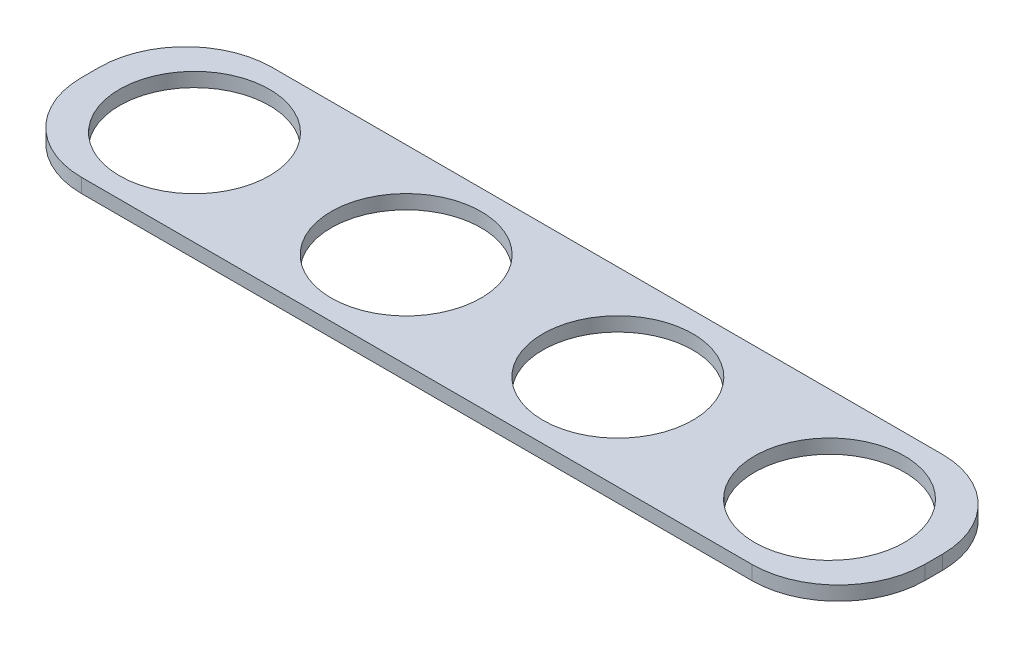
ISO-10303-21;
HEADER;
FILE_DESCRIPTION(('STEP AP214'),'2;1');
FILE_NAME('part.step','',(''),(''),'','','');
FILE_SCHEMA(('AUTOMOTIVE_DESIGN { 1 0 10303 214 1 1 1 1 }'));
ENDSEC;
DATA;
#1=APPLICATION_CONTEXT('core data for automotive mechanical design processes');
#2=APPLICATION_PROTOCOL_DEFINITION('international standard','automotive_design',2000,#1);
#3=PRODUCT_CONTEXT('',#1,'mechanical');
#4=PRODUCT('Part','Part','',(#3));
#5=PRODUCT_RELATED_PRODUCT_CATEGORY('part','',(#4));
#6=PRODUCT_DEFINITION_FORMATION('','',#4);
#7=PRODUCT_DEFINITION_CONTEXT('part definition',#1,'design');
#8=PRODUCT_DEFINITION('design','',#6,#7);
#9=PRODUCT_DEFINITION_SHAPE('','',#8);
#10=(LENGTH_UNIT() NAMED_UNIT(*) SI_UNIT(.MILLI.,.METRE.));
#11=(NAMED_UNIT(*) PLANE_ANGLE_UNIT() SI_UNIT($,.RADIAN.));
#12=(NAMED_UNIT(*) SI_UNIT($,.STERADIAN.) SOLID_ANGLE_UNIT());
#13=UNCERTAINTY_MEASURE_WITH_UNIT(LENGTH_MEASURE(1.E-05),#10,'distance_accuracy_value','');
#14=(GEOMETRIC_REPRESENTATION_CONTEXT(3) GLOBAL_UNCERTAINTY_ASSIGNED_CONTEXT((#13)) GLOBAL_UNIT_ASSIGNED_CONTEXT((#10,
#11,#12)) REPRESENTATION_CONTEXT('',''));
#15=CARTESIAN_POINT('',(0.,0.,0.));
#16=DIRECTION('',(0.,0.,1.));
#17=DIRECTION('',(1.,0.,0.));
#18=AXIS2_PLACEMENT_3D('',#15,#16,#17);
#19=CARTESIAN_POINT('',(-23.9,0.8,5.4));
#20=DIRECTION('',(1.,0.,0.));
#21=DIRECTION('',(0.,0.,-1.));
#22=AXIS2_PLACEMENT_3D('',#19,#20,#21);
#23=PLANE('',#22);
#24=DIRECTION('',(0.,0.,1.));
#25=VECTOR('',#24,1.);
#26=CARTESIAN_POINT('',(-23.9,0.8,5.4));
#27=LINE('',#26,#25);
#28=CARTESIAN_POINT('',(-23.9,0.8,-0.500000000000005));
#29=VERTEX_POINT('',#28);
#30=CARTESIAN_POINT('',(-23.9,0.8,0.5));
#31=VERTEX_POINT('',#30);
#32=EDGE_CURVE('E118',#29,#31,#27,.T.);
#33=ORIENTED_EDGE('',*,*,#32,.F.);
#34=DIRECTION('',(0.,-1.,0.));
#35=VECTOR('',#34,1.);
#36=CARTESIAN_POINT('',(-23.9,0.8,-0.500000000000007));
#37=LINE('',#36,#35);
#38=CARTESIAN_POINT('',(-23.9,0.,-0.500000000000005));
#39=VERTEX_POINT('',#38);
#40=EDGE_CURVE('E103',#29,#39,#37,.T.);
#41=ORIENTED_EDGE('',*,*,#40,.T.);
#42=DIRECTION('',(0.,0.,1.));
#43=VECTOR('',#42,1.);
#44=CARTESIAN_POINT('',(-23.9,0.,5.4));
#45=LINE('',#44,#43);
#46=CARTESIAN_POINT('',(-23.9,0.,0.5));
#47=VERTEX_POINT('',#46);
#48=EDGE_CURVE('E115',#39,#47,#45,.T.);
#49=ORIENTED_EDGE('',*,*,#48,.T.);
#50=DIRECTION('',(0.,-1.,0.));
#51=VECTOR('',#50,1.);
#52=CARTESIAN_POINT('',(-23.9,0.8,0.499999999999998));
#53=LINE('',#52,#51);
#54=EDGE_CURVE('E120',#47,#31,#53,.F.);
#55=ORIENTED_EDGE('',*,*,#54,.T.);
#56=EDGE_LOOP('',(#33,#41,#49,#55));
#57=FACE_BOUND('',#56,.T.);
#58=ADVANCED_FACE('F33',(#57),#23,.F.);
#59=CARTESIAN_POINT('',(23.9,0.8,5.39999999999999));
#60=DIRECTION('',(0.,0.,-1.));
#61=DIRECTION('',(-1.,0.,0.));
#62=AXIS2_PLACEMENT_3D('',#59,#60,#61);
#63=PLANE('',#62);
#64=DIRECTION('',(1.,0.,0.));
#65=VECTOR('',#64,1.);
#66=CARTESIAN_POINT('',(23.9,0.,5.39999999999999));
#67=LINE('',#66,#65);
#68=CARTESIAN_POINT('',(-19.,0.,5.4));
#69=VERTEX_POINT('',#68);
#70=CARTESIAN_POINT('',(19.,0.,5.39999999999999));
#71=VERTEX_POINT('',#70);
#72=EDGE_CURVE('E124',#69,#71,#67,.T.);
#73=ORIENTED_EDGE('',*,*,#72,.T.);
#74=DIRECTION('',(0.,-1.,0.));
#75=VECTOR('',#74,1.);
#76=CARTESIAN_POINT('',(19.,0.8,5.39999999999999));
#77=LINE('',#76,#75);
#78=CARTESIAN_POINT('',(19.,0.8,5.39999999999999));
#79=VERTEX_POINT('',#78);
#80=EDGE_CURVE('E11',#71,#79,#77,.F.);
#81=ORIENTED_EDGE('',*,*,#80,.T.);
#82=DIRECTION('',(1.,0.,0.));
#83=VECTOR('',#82,1.);
#84=CARTESIAN_POINT('',(23.9,0.8,5.39999999999999));
#85=LINE('',#84,#83);
#86=CARTESIAN_POINT('',(-19.,0.8,5.4));
#87=VERTEX_POINT('',#86);
#88=EDGE_CURVE('E164',#87,#79,#85,.T.);
#89=ORIENTED_EDGE('',*,*,#88,.F.);
#90=DIRECTION('',(0.,-1.,0.));
#91=VECTOR('',#90,1.);
#92=CARTESIAN_POINT('',(-19.,0.8,5.4));
#93=LINE('',#92,#91);
#94=EDGE_CURVE('E41',#87,#69,#93,.T.);
#95=ORIENTED_EDGE('',*,*,#94,.T.);
#96=EDGE_LOOP('',(#73,#81,#89,#95));
#97=FACE_BOUND('',#96,.T.);
#98=ADVANCED_FACE('F162',(#97),#63,.F.);
#99=CARTESIAN_POINT('',(23.9,0.8,5.39999999999999));
#100=DIRECTION('',(-1.,0.,0.));
#101=DIRECTION('',(0.,0.,1.));
#102=AXIS2_PLACEMENT_3D('',#99,#100,#101);
#103=PLANE('',#102);
#104=DIRECTION('',(0.,0.,-1.));
#105=VECTOR('',#104,1.);
#106=CARTESIAN_POINT('',(23.9,0.,5.39999999999999));
#107=LINE('',#106,#105);
#108=CARTESIAN_POINT('',(23.9,0.,0.499999999999995));
#109=VERTEX_POINT('',#108);
#110=CARTESIAN_POINT('',(23.9,0.,-0.50000000000001));
#111=VERTEX_POINT('',#110);
#112=EDGE_CURVE('E128',#109,#111,#107,.T.);
#113=ORIENTED_EDGE('',*,*,#112,.T.);
#114=DIRECTION('',(0.,-1.,0.));
#115=VECTOR('',#114,1.);
#116=CARTESIAN_POINT('',(23.9,0.8,-0.500000000000012));
#117=LINE('',#116,#115);
#118=CARTESIAN_POINT('',(23.9,0.8,-0.50000000000001));
#119=VERTEX_POINT('',#118);
#120=EDGE_CURVE('E48',#111,#119,#117,.F.);
#121=ORIENTED_EDGE('',*,*,#120,.T.);
#122=DIRECTION('',(0.,0.,-1.));
#123=VECTOR('',#122,1.);
#124=CARTESIAN_POINT('',(23.9,0.8,5.39999999999999));
#125=LINE('',#124,#123);
#126=CARTESIAN_POINT('',(23.9,0.8,0.499999999999995));
#127=VERTEX_POINT('',#126);
#128=EDGE_CURVE('E172',#127,#119,#125,.T.);
#129=ORIENTED_EDGE('',*,*,#128,.F.);
#130=DIRECTION('',(0.,-1.,0.));
#131=VECTOR('',#130,1.);
#132=CARTESIAN_POINT('',(23.9,0.8,0.499999999999994));
#133=LINE('',#132,#131);
#134=EDGE_CURVE('E155',#127,#109,#133,.T.);
#135=ORIENTED_EDGE('',*,*,#134,.T.);
#136=EDGE_LOOP('',(#113,#121,#129,#135));
#137=FACE_BOUND('',#136,.T.);
#138=ADVANCED_FACE('F171',(#137),#103,.F.);
#139=CARTESIAN_POINT('',(23.9,0.8,-5.40000000000001));
#140=DIRECTION('',(0.,0.,1.));
#141=DIRECTION('',(1.,0.,0.));
#142=AXIS2_PLACEMENT_3D('',#139,#140,#141);
#143=PLANE('',#142);
#144=DIRECTION('',(-1.,0.,0.));
#145=VECTOR('',#144,1.);
#146=CARTESIAN_POINT('',(23.9,0.,-5.40000000000001));
#147=LINE('',#146,#145);
#148=CARTESIAN_POINT('',(19.,0.,-5.40000000000001));
#149=VERTEX_POINT('',#148);
#150=CARTESIAN_POINT('',(-19.,0.,-5.40000000000001));
#151=VERTEX_POINT('',#150);
#152=EDGE_CURVE('E138',#149,#151,#147,.T.);
#153=ORIENTED_EDGE('',*,*,#152,.T.);
#154=DIRECTION('',(0.,-1.,0.));
#155=VECTOR('',#154,1.);
#156=CARTESIAN_POINT('',(-19.,0.8,-5.40000000000001));
#157=LINE('',#156,#155);
#158=CARTESIAN_POINT('',(-19.,0.8,-5.40000000000001));
#159=VERTEX_POINT('',#158);
#160=EDGE_CURVE('E104',#151,#159,#157,.F.);
#161=ORIENTED_EDGE('',*,*,#160,.T.);
#162=DIRECTION('',(-1.,0.,0.));
#163=VECTOR('',#162,1.);
#164=CARTESIAN_POINT('',(23.9,0.8,-5.40000000000001));
#165=LINE('',#164,#163);
#166=CARTESIAN_POINT('',(19.,0.8,-5.40000000000001));
#167=VERTEX_POINT('',#166);
#168=EDGE_CURVE('E134',#167,#159,#165,.T.);
#169=ORIENTED_EDGE('',*,*,#168,.F.);
#170=DIRECTION('',(0.,-1.,0.));
#171=VECTOR('',#170,1.);
#172=CARTESIAN_POINT('',(19.,0.8,-5.40000000000001));
#173=LINE('',#172,#171);
#174=EDGE_CURVE('E109',#167,#149,#173,.T.);
#175=ORIENTED_EDGE('',*,*,#174,.T.);
#176=EDGE_LOOP('',(#153,#161,#169,#175));
#177=FACE_BOUND('',#176,.T.);
#178=ADVANCED_FACE('F205',(#177),#143,.F.);
#179=CARTESIAN_POINT('',(0.,0.8,0.));
#180=DIRECTION('',(0.,1.,0.));
#181=DIRECTION('',(0.,0.,1.));
#182=AXIS2_PLACEMENT_3D('',#179,#180,#181);
#183=PLANE('',#182);
#184=CARTESIAN_POINT('',(-18.,0.8,0.));
#185=DIRECTION('',(0.,1.,0.));
#186=DIRECTION('',(0.,0.,1.));
#187=AXIS2_PLACEMENT_3D('',#184,#185,#186);
#188=CIRCLE('',#187,4.25);
#189=CARTESIAN_POINT('',(-18.,0.8,4.25));
#190=VERTEX_POINT('',#189);
#191=EDGE_CURVE('E184',#190,#190,#188,.T.);
#192=ORIENTED_EDGE('',*,*,#191,.F.);
#193=EDGE_LOOP('',(#192));
#194=FACE_BOUND('',#193,.T.);
#195=CARTESIAN_POINT('',(18.,0.8,0.));
#196=DIRECTION('',(0.,1.,0.));
#197=DIRECTION('',(0.,0.,-1.));
#198=AXIS2_PLACEMENT_3D('',#195,#196,#197);
#199=CIRCLE('',#198,4.25);
#200=CARTESIAN_POINT('',(18.,0.8,4.24999999999999));
#201=VERTEX_POINT('',#200);
#202=EDGE_CURVE('E185',#201,#201,#199,.T.);
#203=ORIENTED_EDGE('',*,*,#202,.F.);
#204=EDGE_LOOP('',(#203));
#205=FACE_BOUND('',#204,.T.);
#206=CARTESIAN_POINT('',(5.99999999999998,0.8,0.));
#207=DIRECTION('',(0.,1.,0.));
#208=DIRECTION('',(0.,0.,-1.));
#209=AXIS2_PLACEMENT_3D('',#206,#207,#208);
#210=CIRCLE('',#209,4.25);
#211=CARTESIAN_POINT('',(5.99999999999998,0.8,4.25));
#212=VERTEX_POINT('',#211);
#213=EDGE_CURVE('E195',#212,#212,#210,.T.);
#214=ORIENTED_EDGE('',*,*,#213,.F.);
#215=EDGE_LOOP('',(#214));
#216=FACE_BOUND('',#215,.T.);
#217=CARTESIAN_POINT('',(-6.00000000000002,0.8,0.));
#218=DIRECTION('',(0.,1.,0.));
#219=DIRECTION('',(0.,0.,1.));
#220=AXIS2_PLACEMENT_3D('',#217,#218,#219);
#221=CIRCLE('',#220,4.25);
#222=CARTESIAN_POINT('',(-6.00000000000002,0.8,4.25));
#223=VERTEX_POINT('',#222);
#224=EDGE_CURVE('E131',#223,#223,#221,.T.);
#225=ORIENTED_EDGE('',*,*,#224,.F.);
#226=EDGE_LOOP('',(#225));
#227=FACE_BOUND('',#226,.T.);
#228=ORIENTED_EDGE('',*,*,#168,.T.);
#229=CARTESIAN_POINT('',(-19.,0.8,-0.500000000000007));
#230=DIRECTION('',(0.,1.,0.));
#231=DIRECTION('',(0.,0.,1.));
#232=AXIS2_PLACEMENT_3D('',#229,#230,#231);
#233=CIRCLE('',#232,4.9);
#234=EDGE_CURVE('E153',#159,#29,#233,.T.);
#235=ORIENTED_EDGE('',*,*,#234,.T.);
#236=ORIENTED_EDGE('',*,*,#32,.T.);
#237=CARTESIAN_POINT('',(-19.,0.8,0.499999999999998));
#238=DIRECTION('',(0.,1.,0.));
#239=DIRECTION('',(0.,0.,1.));
#240=AXIS2_PLACEMENT_3D('',#237,#238,#239);
#241=CIRCLE('',#240,4.9);
#242=EDGE_CURVE('E148',#31,#87,#241,.T.);
#243=ORIENTED_EDGE('',*,*,#242,.T.);
#244=ORIENTED_EDGE('',*,*,#88,.T.);
#245=CARTESIAN_POINT('',(19.,0.8,0.499999999999994));
#246=DIRECTION('',(0.,1.,0.));
#247=DIRECTION('',(0.,0.,1.));
#248=AXIS2_PLACEMENT_3D('',#245,#246,#247);
#249=CIRCLE('',#248,4.9);
#250=EDGE_CURVE('E55',#79,#127,#249,.T.);
#251=ORIENTED_EDGE('',*,*,#250,.T.);
#252=ORIENTED_EDGE('',*,*,#128,.T.);
#253=CARTESIAN_POINT('',(19.,0.8,-0.500000000000012));
#254=DIRECTION('',(0.,1.,0.));
#255=DIRECTION('',(0.,0.,1.));
#256=AXIS2_PLACEMENT_3D('',#253,#254,#255);
#257=CIRCLE('',#256,4.9);
#258=EDGE_CURVE('E151',#119,#167,#257,.T.);
#259=ORIENTED_EDGE('',*,*,#258,.T.);
#260=EDGE_LOOP('',(#228,#235,#236,#243,#244,#251,#252,#259));
#261=FACE_BOUND('',#260,.T.);
#262=ADVANCED_FACE('F202',(#194,#205,#216,#227,#261),#183,.T.);
#263=CARTESIAN_POINT('',(0.,0.,0.));
#264=DIRECTION('',(0.,1.,0.));
#265=DIRECTION('',(0.,0.,1.));
#266=AXIS2_PLACEMENT_3D('',#263,#264,#265);
#267=PLANE('',#266);
#268=CARTESIAN_POINT('',(-18.,0.,0.));
#269=DIRECTION('',(0.,1.,0.));
#270=DIRECTION('',(0.,0.,1.));
#271=AXIS2_PLACEMENT_3D('',#268,#269,#270);
#272=CIRCLE('',#271,4.25);
#273=CARTESIAN_POINT('',(-18.,0.,4.25));
#274=VERTEX_POINT('',#273);
#275=EDGE_CURVE('E180',#274,#274,#272,.F.);
#276=ORIENTED_EDGE('',*,*,#275,.F.);
#277=EDGE_LOOP('',(#276));
#278=FACE_BOUND('',#277,.T.);
#279=CARTESIAN_POINT('',(18.,0.,0.));
#280=DIRECTION('',(0.,1.,0.));
#281=DIRECTION('',(0.,0.,1.));
#282=AXIS2_PLACEMENT_3D('',#279,#280,#281);
#283=CIRCLE('',#282,4.25);
#284=CARTESIAN_POINT('',(18.,0.,4.24999999999999));
#285=VERTEX_POINT('',#284);
#286=EDGE_CURVE('E181',#285,#285,#283,.F.);
#287=ORIENTED_EDGE('',*,*,#286,.F.);
#288=EDGE_LOOP('',(#287));
#289=FACE_BOUND('',#288,.T.);
#290=CARTESIAN_POINT('',(5.99999999999998,0.,0.));
#291=DIRECTION('',(0.,1.,0.));
#292=DIRECTION('',(0.,0.,1.));
#293=AXIS2_PLACEMENT_3D('',#290,#291,#292);
#294=CIRCLE('',#293,4.25);
#295=CARTESIAN_POINT('',(5.99999999999998,0.,4.25));
#296=VERTEX_POINT('',#295);
#297=EDGE_CURVE('E188',#296,#296,#294,.F.);
#298=ORIENTED_EDGE('',*,*,#297,.F.);
#299=EDGE_LOOP('',(#298));
#300=FACE_BOUND('',#299,.T.);
#301=CARTESIAN_POINT('',(-6.00000000000002,0.,0.));
#302=DIRECTION('',(0.,1.,0.));
#303=DIRECTION('',(0.,0.,1.));
#304=AXIS2_PLACEMENT_3D('',#301,#302,#303);
#305=CIRCLE('',#304,4.25);
#306=CARTESIAN_POINT('',(-6.00000000000002,0.,4.25));
#307=VERTEX_POINT('',#306);
#308=EDGE_CURVE('E125',#307,#307,#305,.F.);
#309=ORIENTED_EDGE('',*,*,#308,.F.);
#310=EDGE_LOOP('',(#309));
#311=FACE_BOUND('',#310,.T.);
#312=ORIENTED_EDGE('',*,*,#48,.F.);
#313=CARTESIAN_POINT('',(-19.,0.,-0.500000000000007));
#314=DIRECTION('',(0.,1.,0.));
#315=DIRECTION('',(0.,0.,1.));
#316=AXIS2_PLACEMENT_3D('',#313,#314,#315);
#317=CIRCLE('',#316,4.9);
#318=EDGE_CURVE('E99',#39,#151,#317,.F.);
#319=ORIENTED_EDGE('',*,*,#318,.T.);
#320=ORIENTED_EDGE('',*,*,#152,.F.);
#321=CARTESIAN_POINT('',(19.,0.,-0.500000000000012));
#322=DIRECTION('',(0.,1.,0.));
#323=DIRECTION('',(0.,0.,1.));
#324=AXIS2_PLACEMENT_3D('',#321,#322,#323);
#325=CIRCLE('',#324,4.9);
#326=EDGE_CURVE('E110',#149,#111,#325,.F.);
#327=ORIENTED_EDGE('',*,*,#326,.T.);
#328=ORIENTED_EDGE('',*,*,#112,.F.);
#329=CARTESIAN_POINT('',(19.,0.,0.499999999999994));
#330=DIRECTION('',(0.,1.,0.));
#331=DIRECTION('',(0.,0.,1.));
#332=AXIS2_PLACEMENT_3D('',#329,#330,#331);
#333=CIRCLE('',#332,4.9);
#334=EDGE_CURVE('E142',#109,#71,#333,.F.);
#335=ORIENTED_EDGE('',*,*,#334,.T.);
#336=ORIENTED_EDGE('',*,*,#72,.F.);
#337=CARTESIAN_POINT('',(-19.,0.,0.499999999999998));
#338=DIRECTION('',(0.,1.,0.));
#339=DIRECTION('',(0.,0.,1.));
#340=AXIS2_PLACEMENT_3D('',#337,#338,#339);
#341=CIRCLE('',#340,4.9);
#342=EDGE_CURVE('E119',#69,#47,#341,.F.);
#343=ORIENTED_EDGE('',*,*,#342,.T.);
#344=EDGE_LOOP('',(#312,#319,#320,#327,#328,#335,#336,#343));
#345=FACE_BOUND('',#344,.T.);
#346=ADVANCED_FACE('F122',(#278,#289,#300,#311,#345),#267,.F.);
#347=CARTESIAN_POINT('',(-6.00000000000002,-0.00100000000000002,0.));
#348=DIRECTION('',(0.,1.,0.));
#349=DIRECTION('',(0.,0.,1.));
#350=AXIS2_PLACEMENT_3D('',#347,#348,#349);
#351=CYLINDRICAL_SURFACE('',#350,4.25);
#352=CARTESIAN_POINT('',(-6.00000000000002,0.8,4.25));
#353=CARTESIAN_POINT('',(-6.00000000000002,0.791666666666667,4.25));
#354=CARTESIAN_POINT('',(-6.00000000000002,0.783333333333333,4.25));
#355=CARTESIAN_POINT('',(-6.00000000000002,0.766666666666667,4.25));
#356=CARTESIAN_POINT('',(-6.00000000000002,0.758333333333333,4.25));
#357=CARTESIAN_POINT('',(-6.00000000000002,0.741666666666667,4.25));
#358=CARTESIAN_POINT('',(-6.00000000000002,0.733333333333333,4.25));
#359=CARTESIAN_POINT('',(-6.00000000000002,0.716666666666667,4.25));
#360=CARTESIAN_POINT('',(-6.00000000000002,0.708333333333333,4.25));
#361=CARTESIAN_POINT('',(-6.00000000000002,0.691666666666667,4.25));
#362=CARTESIAN_POINT('',(-6.00000000000002,0.683333333333333,4.25));
#363=CARTESIAN_POINT('',(-6.00000000000002,0.666666666666667,4.25));
#364=CARTESIAN_POINT('',(-6.00000000000002,0.658333333333333,4.25));
#365=CARTESIAN_POINT('',(-6.00000000000002,0.641666666666667,4.25));
#366=CARTESIAN_POINT('',(-6.00000000000002,0.633333333333333,4.25));
#367=CARTESIAN_POINT('',(-6.00000000000002,0.616666666666667,4.25));
#368=CARTESIAN_POINT('',(-6.00000000000002,0.608333333333333,4.25));
#369=CARTESIAN_POINT('',(-6.00000000000002,0.591666666666667,4.25));
#370=CARTESIAN_POINT('',(-6.00000000000002,0.583333333333333,4.25));
#371=CARTESIAN_POINT('',(-6.00000000000002,0.566666666666667,4.25));
#372=CARTESIAN_POINT('',(-6.00000000000002,0.558333333333333,4.25));
#373=CARTESIAN_POINT('',(-6.00000000000002,0.541666666666667,4.25));
#374=CARTESIAN_POINT('',(-6.00000000000002,0.533333333333333,4.25));
#375=CARTESIAN_POINT('',(-6.00000000000002,0.516666666666667,4.25));
#376=CARTESIAN_POINT('',(-6.00000000000002,0.508333333333333,4.25));
#377=CARTESIAN_POINT('',(-6.00000000000002,0.491666666666667,4.25));
#378=CARTESIAN_POINT('',(-6.00000000000002,0.483333333333333,4.25));
#379=CARTESIAN_POINT('',(-6.00000000000002,0.466666666666667,4.25));
#380=CARTESIAN_POINT('',(-6.00000000000002,0.458333333333333,4.25));
#381=CARTESIAN_POINT('',(-6.00000000000002,0.441666666666667,4.25));
#382=CARTESIAN_POINT('',(-6.00000000000002,0.433333333333333,4.25));
#383=CARTESIAN_POINT('',(-6.00000000000002,0.416666666666667,4.25));
#384=CARTESIAN_POINT('',(-6.00000000000002,0.408333333333333,4.25));
#385=CARTESIAN_POINT('',(-6.00000000000002,0.391666666666667,4.25));
#386=CARTESIAN_POINT('',(-6.00000000000002,0.383333333333333,4.25));
#387=CARTESIAN_POINT('',(-6.00000000000002,0.366666666666667,4.25));
#388=CARTESIAN_POINT('',(-6.00000000000002,0.358333333333333,4.25));
#389=CARTESIAN_POINT('',(-6.00000000000002,0.341666666666667,4.25));
#390=CARTESIAN_POINT('',(-6.00000000000002,0.333333333333333,4.25));
#391=CARTESIAN_POINT('',(-6.00000000000002,0.316666666666667,4.25));
#392=CARTESIAN_POINT('',(-6.00000000000002,0.308333333333333,4.25));
#393=CARTESIAN_POINT('',(-6.00000000000002,0.291666666666667,4.25));
#394=CARTESIAN_POINT('',(-6.00000000000002,0.283333333333333,4.25));
#395=CARTESIAN_POINT('',(-6.00000000000002,0.266666666666667,4.25));
#396=CARTESIAN_POINT('',(-6.00000000000002,0.258333333333333,4.25));
#397=CARTESIAN_POINT('',(-6.00000000000002,0.241666666666667,4.25));
#398=CARTESIAN_POINT('',(-6.00000000000002,0.233333333333333,4.25));
#399=CARTESIAN_POINT('',(-6.00000000000002,0.216666666666667,4.25));
#400=CARTESIAN_POINT('',(-6.00000000000002,0.208333333333333,4.25));
#401=CARTESIAN_POINT('',(-6.00000000000002,0.191666666666667,4.25));
#402=CARTESIAN_POINT('',(-6.00000000000002,0.183333333333333,4.25));
#403=CARTESIAN_POINT('',(-6.00000000000002,0.166666666666667,4.25));
#404=CARTESIAN_POINT('',(-6.00000000000002,0.158333333333333,4.25));
#405=CARTESIAN_POINT('',(-6.00000000000002,0.141666666666667,4.25));
#406=CARTESIAN_POINT('',(-6.00000000000002,0.133333333333333,4.25));
#407=CARTESIAN_POINT('',(-6.00000000000002,0.116666666666667,4.25));
#408=CARTESIAN_POINT('',(-6.00000000000002,0.108333333333333,4.25));
#409=CARTESIAN_POINT('',(-6.00000000000002,0.0916666666666667,4.25));
#410=CARTESIAN_POINT('',(-6.00000000000002,0.0833333333333333,4.25));
#411=CARTESIAN_POINT('',(-6.00000000000002,0.0666666666666666,4.25));
#412=CARTESIAN_POINT('',(-6.00000000000002,0.0583333333333333,4.25));
#413=CARTESIAN_POINT('',(-6.00000000000002,0.0416666666666667,4.25));
#414=CARTESIAN_POINT('',(-6.00000000000002,0.0333333333333333,4.25));
#415=CARTESIAN_POINT('',(-6.00000000000002,0.0166666666666666,4.25));
#416=CARTESIAN_POINT('',(-6.00000000000002,0.00833333333333331,4.25));
#417=CARTESIAN_POINT('',(-6.00000000000002,0.,4.25));
#418=B_SPLINE_CURVE_WITH_KNOTS('',3,(#352,#353,#354,#355,#356,#357,#358,#359,#360,#361,#362,
#363,#364,#365,#366,#367,#368,#369,#370,#371,#372,#373,#374,#375,#376,#377,#378,#379,#380,#381,
#382,#383,#384,#385,#386,#387,#388,#389,#390,#391,#392,#393,#394,#395,#396,#397,#398,#399,#400,
#401,#402,#403,#404,#405,#406,#407,#408,#409,#410,#411,#412,#413,#414,#415,#416,#417),
.UNSPECIFIED.,.F.,.F.,(4,2,2,2,2,2,2,2,2,2,2,2,2,2,2,2,2,2,2,2,2,2,2,2,2,2,2,2,2,2,2,2,4),(0.,
0.025,0.05,0.075,0.1,0.125,0.15,0.175,0.2,0.225,0.25,0.275,0.3,0.325,0.35,0.375,0.4,0.425,0.45,
0.475,0.5,0.525,0.55,0.575,0.6,0.625,0.65,0.675,0.7,0.725,0.75,0.775,0.8),.UNSPECIFIED.);
#419=EDGE_CURVE('BSEAM234',#223,#307,#418,.T.);
#420=ORIENTED_EDGE('',*,*,#224,.T.);
#421=ORIENTED_EDGE('',*,*,#308,.T.);
#422=ORIENTED_EDGE('',*,*,#419,.T.);
#423=ORIENTED_EDGE('',*,*,#419,.F.);
#424=EDGE_LOOP('',(#420,#422,#421,#423));
#425=FACE_BOUND('',#424,.T.);
#426=ADVANCED_FACE('F234',(#425),#351,.F.);
#427=CARTESIAN_POINT('',(5.99999999999998,-0.00100000000000002,0.));
#428=DIRECTION('',(0.,1.,0.));
#429=DIRECTION('',(0.,0.,1.));
#430=AXIS2_PLACEMENT_3D('',#427,#428,#429);
#431=CYLINDRICAL_SURFACE('',#430,4.25);
#432=CARTESIAN_POINT('',(5.99999999999998,0.8,4.25));
#433=CARTESIAN_POINT('',(5.99999999999998,0.791666666666667,4.25));
#434=CARTESIAN_POINT('',(5.99999999999998,0.783333333333333,4.25));
#435=CARTESIAN_POINT('',(5.99999999999998,0.766666666666667,4.25));
#436=CARTESIAN_POINT('',(5.99999999999998,0.758333333333333,4.25));
#437=CARTESIAN_POINT('',(5.99999999999998,0.741666666666667,4.25));
#438=CARTESIAN_POINT('',(5.99999999999998,0.733333333333333,4.25));
#439=CARTESIAN_POINT('',(5.99999999999998,0.716666666666667,4.25));
#440=CARTESIAN_POINT('',(5.99999999999998,0.708333333333333,4.25));
#441=CARTESIAN_POINT('',(5.99999999999998,0.691666666666667,4.25));
#442=CARTESIAN_POINT('',(5.99999999999998,0.683333333333333,4.25));
#443=CARTESIAN_POINT('',(5.99999999999998,0.666666666666667,4.25));
#444=CARTESIAN_POINT('',(5.99999999999998,0.658333333333333,4.25));
#445=CARTESIAN_POINT('',(5.99999999999998,0.641666666666667,4.25));
#446=CARTESIAN_POINT('',(5.99999999999998,0.633333333333333,4.25));
#447=CARTESIAN_POINT('',(5.99999999999998,0.616666666666667,4.25));
#448=CARTESIAN_POINT('',(5.99999999999998,0.608333333333333,4.25));
#449=CARTESIAN_POINT('',(5.99999999999998,0.591666666666667,4.25));
#450=CARTESIAN_POINT('',(5.99999999999998,0.583333333333333,4.25));
#451=CARTESIAN_POINT('',(5.99999999999998,0.566666666666667,4.25));
#452=CARTESIAN_POINT('',(5.99999999999998,0.558333333333333,4.25));
#453=CARTESIAN_POINT('',(5.99999999999998,0.541666666666667,4.25));
#454=CARTESIAN_POINT('',(5.99999999999998,0.533333333333333,4.25));
#455=CARTESIAN_POINT('',(5.99999999999998,0.516666666666667,4.25));
#456=CARTESIAN_POINT('',(5.99999999999998,0.508333333333333,4.25));
#457=CARTESIAN_POINT('',(5.99999999999998,0.491666666666667,4.25));
#458=CARTESIAN_POINT('',(5.99999999999998,0.483333333333333,4.25));
#459=CARTESIAN_POINT('',(5.99999999999998,0.466666666666667,4.25));
#460=CARTESIAN_POINT('',(5.99999999999998,0.458333333333333,4.25));
#461=CARTESIAN_POINT('',(5.99999999999998,0.441666666666667,4.25));
#462=CARTESIAN_POINT('',(5.99999999999998,0.433333333333333,4.25));
#463=CARTESIAN_POINT('',(5.99999999999998,0.416666666666667,4.25));
#464=CARTESIAN_POINT('',(5.99999999999998,0.408333333333333,4.25));
#465=CARTESIAN_POINT('',(5.99999999999998,0.391666666666667,4.25));
#466=CARTESIAN_POINT('',(5.99999999999998,0.383333333333333,4.25));
#467=CARTESIAN_POINT('',(5.99999999999998,0.366666666666667,4.25));
#468=CARTESIAN_POINT('',(5.99999999999998,0.358333333333333,4.25));
#469=CARTESIAN_POINT('',(5.99999999999998,0.341666666666667,4.25));
#470=CARTESIAN_POINT('',(5.99999999999998,0.333333333333333,4.25));
#471=CARTESIAN_POINT('',(5.99999999999998,0.316666666666667,4.25));
#472=CARTESIAN_POINT('',(5.99999999999998,0.308333333333333,4.25));
#473=CARTESIAN_POINT('',(5.99999999999998,0.291666666666667,4.25));
#474=CARTESIAN_POINT('',(5.99999999999998,0.283333333333333,4.25));
#475=CARTESIAN_POINT('',(5.99999999999998,0.266666666666667,4.25));
#476=CARTESIAN_POINT('',(5.99999999999998,0.258333333333333,4.25));
#477=CARTESIAN_POINT('',(5.99999999999998,0.241666666666667,4.25));
#478=CARTESIAN_POINT('',(5.99999999999998,0.233333333333333,4.25));
#479=CARTESIAN_POINT('',(5.99999999999998,0.216666666666667,4.25));
#480=CARTESIAN_POINT('',(5.99999999999998,0.208333333333333,4.25));
#481=CARTESIAN_POINT('',(5.99999999999998,0.191666666666667,4.25));
#482=CARTESIAN_POINT('',(5.99999999999998,0.183333333333333,4.25));
#483=CARTESIAN_POINT('',(5.99999999999998,0.166666666666667,4.25));
#484=CARTESIAN_POINT('',(5.99999999999998,0.158333333333333,4.25));
#485=CARTESIAN_POINT('',(5.99999999999998,0.141666666666667,4.25));
#486=CARTESIAN_POINT('',(5.99999999999998,0.133333333333333,4.25));
#487=CARTESIAN_POINT('',(5.99999999999998,0.116666666666667,4.25));
#488=CARTESIAN_POINT('',(5.99999999999998,0.108333333333333,4.25));
#489=CARTESIAN_POINT('',(5.99999999999998,0.0916666666666667,4.25));
#490=CARTESIAN_POINT('',(5.99999999999998,0.0833333333333333,4.25));
#491=CARTESIAN_POINT('',(5.99999999999998,0.0666666666666666,4.25));
#492=CARTESIAN_POINT('',(5.99999999999998,0.0583333333333333,4.25));
#493=CARTESIAN_POINT('',(5.99999999999998,0.0416666666666667,4.25));
#494=CARTESIAN_POINT('',(5.99999999999998,0.0333333333333333,4.25));
#495=CARTESIAN_POINT('',(5.99999999999998,0.0166666666666666,4.25));
#496=CARTESIAN_POINT('',(5.99999999999998,0.00833333333333331,4.25));
#497=CARTESIAN_POINT('',(5.99999999999998,0.,4.25));
#498=B_SPLINE_CURVE_WITH_KNOTS('',3,(#432,#433,#434,#435,#436,#437,#438,#439,#440,#441,#442,
#443,#444,#445,#446,#447,#448,#449,#450,#451,#452,#453,#454,#455,#456,#457,#458,#459,#460,#461,
#462,#463,#464,#465,#466,#467,#468,#469,#470,#471,#472,#473,#474,#475,#476,#477,#478,#479,#480,
#481,#482,#483,#484,#485,#486,#487,#488,#489,#490,#491,#492,#493,#494,#495,#496,#497),
.UNSPECIFIED.,.F.,.F.,(4,2,2,2,2,2,2,2,2,2,2,2,2,2,2,2,2,2,2,2,2,2,2,2,2,2,2,2,2,2,2,2,4),(0.,
0.025,0.05,0.075,0.1,0.125,0.15,0.175,0.2,0.225,0.25,0.275,0.3,0.325,0.35,0.375,0.4,0.425,0.45,
0.475,0.5,0.525,0.55,0.575,0.6,0.625,0.65,0.675,0.7,0.725,0.75,0.775,0.8),.UNSPECIFIED.);
#499=EDGE_CURVE('BSEAM199',#212,#296,#498,.T.);
#500=ORIENTED_EDGE('',*,*,#213,.T.);
#501=ORIENTED_EDGE('',*,*,#297,.T.);
#502=ORIENTED_EDGE('',*,*,#499,.T.);
#503=ORIENTED_EDGE('',*,*,#499,.F.);
#504=EDGE_LOOP('',(#500,#502,#501,#503));
#505=FACE_BOUND('',#504,.T.);
#506=ADVANCED_FACE('F199',(#505),#431,.F.);
#507=CARTESIAN_POINT('',(18.,-0.00100000000000002,0.));
#508=DIRECTION('',(0.,1.,0.));
#509=DIRECTION('',(0.,0.,1.));
#510=AXIS2_PLACEMENT_3D('',#507,#508,#509);
#511=CYLINDRICAL_SURFACE('',#510,4.25);
#512=CARTESIAN_POINT('',(18.,0.8,4.24999999999999));
#513=CARTESIAN_POINT('',(18.,0.791666666666667,4.24999999999999));
#514=CARTESIAN_POINT('',(18.,0.783333333333333,4.24999999999999));
#515=CARTESIAN_POINT('',(18.,0.766666666666667,4.24999999999999));
#516=CARTESIAN_POINT('',(18.,0.758333333333333,4.24999999999999));
#517=CARTESIAN_POINT('',(18.,0.741666666666667,4.24999999999999));
#518=CARTESIAN_POINT('',(18.,0.733333333333333,4.24999999999999));
#519=CARTESIAN_POINT('',(18.,0.716666666666667,4.24999999999999));
#520=CARTESIAN_POINT('',(18.,0.708333333333333,4.24999999999999));
#521=CARTESIAN_POINT('',(18.,0.691666666666667,4.24999999999999));
#522=CARTESIAN_POINT('',(18.,0.683333333333333,4.24999999999999));
#523=CARTESIAN_POINT('',(18.,0.666666666666667,4.24999999999999));
#524=CARTESIAN_POINT('',(18.,0.658333333333333,4.24999999999999));
#525=CARTESIAN_POINT('',(18.,0.641666666666667,4.24999999999999));
#526=CARTESIAN_POINT('',(18.,0.633333333333333,4.24999999999999));
#527=CARTESIAN_POINT('',(18.,0.616666666666667,4.24999999999999));
#528=CARTESIAN_POINT('',(18.,0.608333333333333,4.24999999999999));
#529=CARTESIAN_POINT('',(18.,0.591666666666667,4.24999999999999));
#530=CARTESIAN_POINT('',(18.,0.583333333333333,4.24999999999999));
#531=CARTESIAN_POINT('',(18.,0.566666666666667,4.24999999999999));
#532=CARTESIAN_POINT('',(18.,0.558333333333333,4.24999999999999));
#533=CARTESIAN_POINT('',(18.,0.541666666666667,4.24999999999999));
#534=CARTESIAN_POINT('',(18.,0.533333333333333,4.24999999999999));
#535=CARTESIAN_POINT('',(18.,0.516666666666667,4.24999999999999));
#536=CARTESIAN_POINT('',(18.,0.508333333333333,4.24999999999999));
#537=CARTESIAN_POINT('',(18.,0.491666666666667,4.24999999999999));
#538=CARTESIAN_POINT('',(18.,0.483333333333333,4.24999999999999));
#539=CARTESIAN_POINT('',(18.,0.466666666666667,4.24999999999999));
#540=CARTESIAN_POINT('',(18.,0.458333333333333,4.24999999999999));
#541=CARTESIAN_POINT('',(18.,0.441666666666667,4.24999999999999));
#542=CARTESIAN_POINT('',(18.,0.433333333333333,4.24999999999999));
#543=CARTESIAN_POINT('',(18.,0.416666666666667,4.24999999999999));
#544=CARTESIAN_POINT('',(18.,0.408333333333333,4.24999999999999));
#545=CARTESIAN_POINT('',(18.,0.391666666666667,4.24999999999999));
#546=CARTESIAN_POINT('',(18.,0.383333333333333,4.24999999999999));
#547=CARTESIAN_POINT('',(18.,0.366666666666667,4.24999999999999));
#548=CARTESIAN_POINT('',(18.,0.358333333333333,4.24999999999999));
#549=CARTESIAN_POINT('',(18.,0.341666666666667,4.24999999999999));
#550=CARTESIAN_POINT('',(18.,0.333333333333333,4.24999999999999));
#551=CARTESIAN_POINT('',(18.,0.316666666666667,4.24999999999999));
#552=CARTESIAN_POINT('',(18.,0.308333333333333,4.24999999999999));
#553=CARTESIAN_POINT('',(18.,0.291666666666667,4.24999999999999));
#554=CARTESIAN_POINT('',(18.,0.283333333333333,4.24999999999999));
#555=CARTESIAN_POINT('',(18.,0.266666666666667,4.24999999999999));
#556=CARTESIAN_POINT('',(18.,0.258333333333333,4.24999999999999));
#557=CARTESIAN_POINT('',(18.,0.241666666666667,4.24999999999999));
#558=CARTESIAN_POINT('',(18.,0.233333333333333,4.24999999999999));
#559=CARTESIAN_POINT('',(18.,0.216666666666667,4.24999999999999));
#560=CARTESIAN_POINT('',(18.,0.208333333333333,4.24999999999999));
#561=CARTESIAN_POINT('',(18.,0.191666666666667,4.24999999999999));
#562=CARTESIAN_POINT('',(18.,0.183333333333333,4.24999999999999));
#563=CARTESIAN_POINT('',(18.,0.166666666666667,4.24999999999999));
#564=CARTESIAN_POINT('',(18.,0.158333333333333,4.24999999999999));
#565=CARTESIAN_POINT('',(18.,0.141666666666667,4.24999999999999));
#566=CARTESIAN_POINT('',(18.,0.133333333333333,4.24999999999999));
#567=CARTESIAN_POINT('',(18.,0.116666666666667,4.24999999999999));
#568=CARTESIAN_POINT('',(18.,0.108333333333333,4.24999999999999));
#569=CARTESIAN_POINT('',(18.,0.0916666666666667,4.24999999999999));
#570=CARTESIAN_POINT('',(18.,0.0833333333333333,4.24999999999999));
#571=CARTESIAN_POINT('',(18.,0.0666666666666666,4.24999999999999));
#572=CARTESIAN_POINT('',(18.,0.0583333333333333,4.24999999999999));
#573=CARTESIAN_POINT('',(18.,0.0416666666666667,4.24999999999999));
#574=CARTESIAN_POINT('',(18.,0.0333333333333333,4.24999999999999));
#575=CARTESIAN_POINT('',(18.,0.0166666666666666,4.24999999999999));
#576=CARTESIAN_POINT('',(18.,0.00833333333333331,4.24999999999999));
#577=CARTESIAN_POINT('',(18.,0.,4.24999999999999));
#578=B_SPLINE_CURVE_WITH_KNOTS('',3,(#512,#513,#514,#515,#516,#517,#518,#519,#520,#521,#522,
#523,#524,#525,#526,#527,#528,#529,#530,#531,#532,#533,#534,#535,#536,#537,#538,#539,#540,#541,
#542,#543,#544,#545,#546,#547,#548,#549,#550,#551,#552,#553,#554,#555,#556,#557,#558,#559,#560,
#561,#562,#563,#564,#565,#566,#567,#568,#569,#570,#571,#572,#573,#574,#575,#576,#577),
.UNSPECIFIED.,.F.,.F.,(4,2,2,2,2,2,2,2,2,2,2,2,2,2,2,2,2,2,2,2,2,2,2,2,2,2,2,2,2,2,2,2,4),(0.,
0.025,0.05,0.075,0.1,0.125,0.15,0.175,0.2,0.225,0.25,0.275,0.3,0.325,0.35,0.375,0.4,0.425,0.45,
0.475,0.5,0.525,0.55,0.575,0.6,0.625,0.65,0.675,0.7,0.725,0.75,0.775,0.8),.UNSPECIFIED.);
#579=EDGE_CURVE('BSEAM240',#201,#285,#578,.T.);
#580=ORIENTED_EDGE('',*,*,#202,.T.);
#581=ORIENTED_EDGE('',*,*,#286,.T.);
#582=ORIENTED_EDGE('',*,*,#579,.T.);
#583=ORIENTED_EDGE('',*,*,#579,.F.);
#584=EDGE_LOOP('',(#580,#582,#581,#583));
#585=FACE_BOUND('',#584,.T.);
#586=ADVANCED_FACE('F240',(#585),#511,.F.);
#587=CARTESIAN_POINT('',(-18.,-0.00100000000000002,0.));
#588=DIRECTION('',(0.,1.,0.));
#589=DIRECTION('',(0.,0.,1.));
#590=AXIS2_PLACEMENT_3D('',#587,#588,#589);
#591=CYLINDRICAL_SURFACE('',#590,4.25);
#592=CARTESIAN_POINT('',(-18.,0.8,4.25));
#593=CARTESIAN_POINT('',(-18.,0.791666666666667,4.25));
#594=CARTESIAN_POINT('',(-18.,0.783333333333333,4.25));
#595=CARTESIAN_POINT('',(-18.,0.766666666666667,4.25));
#596=CARTESIAN_POINT('',(-18.,0.758333333333333,4.25));
#597=CARTESIAN_POINT('',(-18.,0.741666666666667,4.25));
#598=CARTESIAN_POINT('',(-18.,0.733333333333333,4.25));
#599=CARTESIAN_POINT('',(-18.,0.716666666666667,4.25));
#600=CARTESIAN_POINT('',(-18.,0.708333333333333,4.25));
#601=CARTESIAN_POINT('',(-18.,0.691666666666667,4.25));
#602=CARTESIAN_POINT('',(-18.,0.683333333333333,4.25));
#603=CARTESIAN_POINT('',(-18.,0.666666666666667,4.25));
#604=CARTESIAN_POINT('',(-18.,0.658333333333333,4.25));
#605=CARTESIAN_POINT('',(-18.,0.641666666666667,4.25));
#606=CARTESIAN_POINT('',(-18.,0.633333333333333,4.25));
#607=CARTESIAN_POINT('',(-18.,0.616666666666667,4.25));
#608=CARTESIAN_POINT('',(-18.,0.608333333333333,4.25));
#609=CARTESIAN_POINT('',(-18.,0.591666666666667,4.25));
#610=CARTESIAN_POINT('',(-18.,0.583333333333333,4.25));
#611=CARTESIAN_POINT('',(-18.,0.566666666666667,4.25));
#612=CARTESIAN_POINT('',(-18.,0.558333333333333,4.25));
#613=CARTESIAN_POINT('',(-18.,0.541666666666667,4.25));
#614=CARTESIAN_POINT('',(-18.,0.533333333333333,4.25));
#615=CARTESIAN_POINT('',(-18.,0.516666666666667,4.25));
#616=CARTESIAN_POINT('',(-18.,0.508333333333333,4.25));
#617=CARTESIAN_POINT('',(-18.,0.491666666666667,4.25));
#618=CARTESIAN_POINT('',(-18.,0.483333333333333,4.25));
#619=CARTESIAN_POINT('',(-18.,0.466666666666667,4.25));
#620=CARTESIAN_POINT('',(-18.,0.458333333333333,4.25));
#621=CARTESIAN_POINT('',(-18.,0.441666666666667,4.25));
#622=CARTESIAN_POINT('',(-18.,0.433333333333333,4.25));
#623=CARTESIAN_POINT('',(-18.,0.416666666666667,4.25));
#624=CARTESIAN_POINT('',(-18.,0.408333333333333,4.25));
#625=CARTESIAN_POINT('',(-18.,0.391666666666667,4.25));
#626=CARTESIAN_POINT('',(-18.,0.383333333333333,4.25));
#627=CARTESIAN_POINT('',(-18.,0.366666666666667,4.25));
#628=CARTESIAN_POINT('',(-18.,0.358333333333333,4.25));
#629=CARTESIAN_POINT('',(-18.,0.341666666666667,4.25));
#630=CARTESIAN_POINT('',(-18.,0.333333333333333,4.25));
#631=CARTESIAN_POINT('',(-18.,0.316666666666667,4.25));
#632=CARTESIAN_POINT('',(-18.,0.308333333333333,4.25));
#633=CARTESIAN_POINT('',(-18.,0.291666666666667,4.25));
#634=CARTESIAN_POINT('',(-18.,0.283333333333333,4.25));
#635=CARTESIAN_POINT('',(-18.,0.266666666666667,4.25));
#636=CARTESIAN_POINT('',(-18.,0.258333333333333,4.25));
#637=CARTESIAN_POINT('',(-18.,0.241666666666667,4.25));
#638=CARTESIAN_POINT('',(-18.,0.233333333333333,4.25));
#639=CARTESIAN_POINT('',(-18.,0.216666666666667,4.25));
#640=CARTESIAN_POINT('',(-18.,0.208333333333333,4.25));
#641=CARTESIAN_POINT('',(-18.,0.191666666666667,4.25));
#642=CARTESIAN_POINT('',(-18.,0.183333333333333,4.25));
#643=CARTESIAN_POINT('',(-18.,0.166666666666667,4.25));
#644=CARTESIAN_POINT('',(-18.,0.158333333333333,4.25));
#645=CARTESIAN_POINT('',(-18.,0.141666666666667,4.25));
#646=CARTESIAN_POINT('',(-18.,0.133333333333333,4.25));
#647=CARTESIAN_POINT('',(-18.,0.116666666666667,4.25));
#648=CARTESIAN_POINT('',(-18.,0.108333333333333,4.25));
#649=CARTESIAN_POINT('',(-18.,0.0916666666666667,4.25));
#650=CARTESIAN_POINT('',(-18.,0.0833333333333333,4.25));
#651=CARTESIAN_POINT('',(-18.,0.0666666666666666,4.25));
#652=CARTESIAN_POINT('',(-18.,0.0583333333333333,4.25));
#653=CARTESIAN_POINT('',(-18.,0.0416666666666667,4.25));
#654=CARTESIAN_POINT('',(-18.,0.0333333333333333,4.25));
#655=CARTESIAN_POINT('',(-18.,0.0166666666666666,4.25));
#656=CARTESIAN_POINT('',(-18.,0.00833333333333331,4.25));
#657=CARTESIAN_POINT('',(-18.,0.,4.25));
#658=B_SPLINE_CURVE_WITH_KNOTS('',3,(#592,#593,#594,#595,#596,#597,#598,#599,#600,#601,#602,
#603,#604,#605,#606,#607,#608,#609,#610,#611,#612,#613,#614,#615,#616,#617,#618,#619,#620,#621,
#622,#623,#624,#625,#626,#627,#628,#629,#630,#631,#632,#633,#634,#635,#636,#637,#638,#639,#640,
#641,#642,#643,#644,#645,#646,#647,#648,#649,#650,#651,#652,#653,#654,#655,#656,#657),
.UNSPECIFIED.,.F.,.F.,(4,2,2,2,2,2,2,2,2,2,2,2,2,2,2,2,2,2,2,2,2,2,2,2,2,2,2,2,2,2,2,2,4),(0.,
0.025,0.05,0.075,0.1,0.125,0.15,0.175,0.2,0.225,0.25,0.275,0.3,0.325,0.35,0.375,0.4,0.425,0.45,
0.475,0.5,0.525,0.55,0.575,0.6,0.625,0.65,0.675,0.7,0.725,0.75,0.775,0.8),.UNSPECIFIED.);
#659=EDGE_CURVE('BSEAM220',#190,#274,#658,.T.);
#660=ORIENTED_EDGE('',*,*,#191,.T.);
#661=ORIENTED_EDGE('',*,*,#275,.T.);
#662=ORIENTED_EDGE('',*,*,#659,.T.);
#663=ORIENTED_EDGE('',*,*,#659,.F.);
#664=EDGE_LOOP('',(#660,#662,#661,#663));
#665=FACE_BOUND('',#664,.T.);
#666=ADVANCED_FACE('F220',(#665),#591,.F.);
#667=CARTESIAN_POINT('',(-19.,0.8,-0.500000000000007));
#668=DIRECTION('',(0.,-1.,0.));
#669=DIRECTION('',(0.,0.,-1.));
#670=AXIS2_PLACEMENT_3D('',#667,#668,#669);
#671=CYLINDRICAL_SURFACE('',#670,4.9);
#672=ORIENTED_EDGE('',*,*,#234,.F.);
#673=ORIENTED_EDGE('',*,*,#160,.F.);
#674=ORIENTED_EDGE('',*,*,#318,.F.);
#675=ORIENTED_EDGE('',*,*,#40,.F.);
#676=EDGE_LOOP('',(#672,#673,#674,#675));
#677=FACE_BOUND('',#676,.T.);
#678=ADVANCED_FACE('F102',(#677),#671,.T.);
#679=CARTESIAN_POINT('',(19.,0.8,-0.500000000000012));
#680=DIRECTION('',(0.,-1.,0.));
#681=DIRECTION('',(0.,0.,-1.));
#682=AXIS2_PLACEMENT_3D('',#679,#680,#681);
#683=CYLINDRICAL_SURFACE('',#682,4.9);
#684=ORIENTED_EDGE('',*,*,#258,.F.);
#685=ORIENTED_EDGE('',*,*,#120,.F.);
#686=ORIENTED_EDGE('',*,*,#326,.F.);
#687=ORIENTED_EDGE('',*,*,#174,.F.);
#688=EDGE_LOOP('',(#684,#685,#686,#687));
#689=FACE_BOUND('',#688,.T.);
#690=ADVANCED_FACE('F213',(#689),#683,.T.);
#691=CARTESIAN_POINT('',(19.,0.8,0.499999999999994));
#692=DIRECTION('',(0.,-1.,0.));
#693=DIRECTION('',(0.,0.,-1.));
#694=AXIS2_PLACEMENT_3D('',#691,#692,#693);
#695=CYLINDRICAL_SURFACE('',#694,4.9);
#696=ORIENTED_EDGE('',*,*,#250,.F.);
#697=ORIENTED_EDGE('',*,*,#80,.F.);
#698=ORIENTED_EDGE('',*,*,#334,.F.);
#699=ORIENTED_EDGE('',*,*,#134,.F.);
#700=EDGE_LOOP('',(#696,#697,#698,#699));
#701=FACE_BOUND('',#700,.T.);
#702=ADVANCED_FACE('F170',(#701),#695,.T.);
#703=CARTESIAN_POINT('',(-19.,0.8,0.499999999999998));
#704=DIRECTION('',(0.,-1.,0.));
#705=DIRECTION('',(0.,0.,-1.));
#706=AXIS2_PLACEMENT_3D('',#703,#704,#705);
#707=CYLINDRICAL_SURFACE('',#706,4.9);
#708=ORIENTED_EDGE('',*,*,#242,.F.);
#709=ORIENTED_EDGE('',*,*,#54,.F.);
#710=ORIENTED_EDGE('',*,*,#342,.F.);
#711=ORIENTED_EDGE('',*,*,#94,.F.);
#712=EDGE_LOOP('',(#708,#709,#710,#711));
#713=FACE_BOUND('',#712,.T.);
#714=ADVANCED_FACE('F35',(#713),#707,.T.);
#715=CLOSED_SHELL('',(#58,#98,#138,#178,#262,#346,#426,#506,#586,#666,#678,#690,#702,#714));
#716=MANIFOLD_SOLID_BREP('B2',#715);
#717=ADVANCED_BREP_SHAPE_REPRESENTATION('',(#18,#716),#14);
#718=SHAPE_DEFINITION_REPRESENTATION(#9,#717);
ENDSEC;
END-ISO-10303-21;
